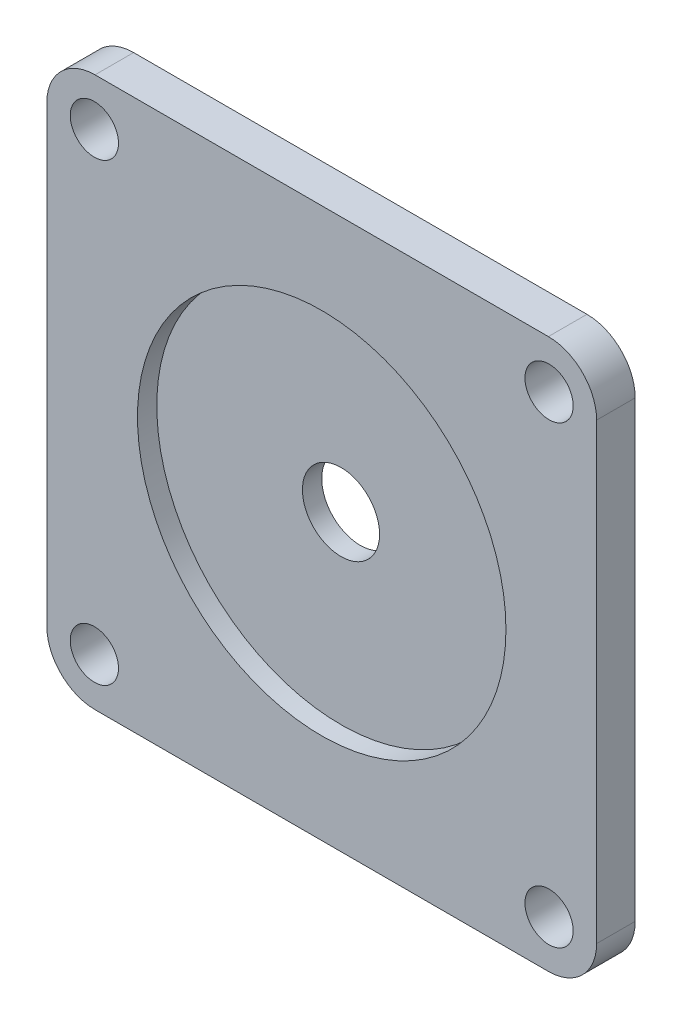
ISO-10303-21;
HEADER;
FILE_DESCRIPTION(('STEP AP214'),'2;1');
FILE_NAME('part.step','',(''),(''),'','','');
FILE_SCHEMA(('AUTOMOTIVE_DESIGN { 1 0 10303 214 1 1 1 1 }'));
ENDSEC;
DATA;
#1=APPLICATION_CONTEXT('core data for automotive mechanical design processes');
#2=APPLICATION_PROTOCOL_DEFINITION('international standard','automotive_design',2000,#1);
#3=PRODUCT_CONTEXT('',#1,'mechanical');
#4=PRODUCT('Part','Part','',(#3));
#5=PRODUCT_RELATED_PRODUCT_CATEGORY('part','',(#4));
#6=PRODUCT_DEFINITION_FORMATION('','',#4);
#7=PRODUCT_DEFINITION_CONTEXT('part definition',#1,'design');
#8=PRODUCT_DEFINITION('design','',#6,#7);
#9=PRODUCT_DEFINITION_SHAPE('','',#8);
#10=(LENGTH_UNIT() NAMED_UNIT(*) SI_UNIT(.MILLI.,.METRE.));
#11=(NAMED_UNIT(*) PLANE_ANGLE_UNIT() SI_UNIT($,.RADIAN.));
#12=(NAMED_UNIT(*) SI_UNIT($,.STERADIAN.) SOLID_ANGLE_UNIT());
#13=UNCERTAINTY_MEASURE_WITH_UNIT(LENGTH_MEASURE(1.E-05),#10,'distance_accuracy_value','');
#14=(GEOMETRIC_REPRESENTATION_CONTEXT(3) GLOBAL_UNCERTAINTY_ASSIGNED_CONTEXT((#13)) GLOBAL_UNIT_ASSIGNED_CONTEXT((#10,
#11,#12)) REPRESENTATION_CONTEXT('',''));
#15=CARTESIAN_POINT('',(0.,0.,0.));
#16=DIRECTION('',(0.,0.,1.));
#17=DIRECTION('',(1.,0.,0.));
#18=AXIS2_PLACEMENT_3D('',#15,#16,#17);
#19=CARTESIAN_POINT('',(0.,0.,4.));
#20=DIRECTION('',(0.,0.,-1.));
#21=DIRECTION('',(-1.,0.,0.));
#22=AXIS2_PLACEMENT_3D('',#19,#20,#21);
#23=PLANE('',#22);
#24=CARTESIAN_POINT('',(0.,0.,4.));
#25=DIRECTION('',(0.,0.,1.));
#26=DIRECTION('',(1.,0.,0.));
#27=AXIS2_PLACEMENT_3D('',#24,#25,#26);
#28=CIRCLE('',#27,19.1);
#29=CARTESIAN_POINT('',(19.1,0.,4.));
#30=VERTEX_POINT('',#29);
#31=EDGE_CURVE('E209',#30,#30,#28,.T.);
#32=ORIENTED_EDGE('',*,*,#31,.F.);
#33=EDGE_LOOP('',(#32));
#34=FACE_BOUND('',#33,.T.);
#35=CARTESIAN_POINT('',(23.57,23.57,4.));
#36=DIRECTION('',(0.,0.,1.));
#37=DIRECTION('',(1.,0.,0.));
#38=AXIS2_PLACEMENT_3D('',#35,#36,#37);
#39=CIRCLE('',#38,2.49999999999999);
#40=CARTESIAN_POINT('',(26.07,23.57,4.));
#41=VERTEX_POINT('',#40);
#42=EDGE_CURVE('E199',#41,#41,#39,.T.);
#43=ORIENTED_EDGE('',*,*,#42,.F.);
#44=EDGE_LOOP('',(#43));
#45=FACE_BOUND('',#44,.T.);
#46=CARTESIAN_POINT('',(23.57,-23.57,4.));
#47=DIRECTION('',(0.,0.,1.));
#48=DIRECTION('',(1.,0.,0.));
#49=AXIS2_PLACEMENT_3D('',#46,#47,#48);
#50=CIRCLE('',#49,2.49999999999999);
#51=CARTESIAN_POINT('',(26.07,-23.57,4.));
#52=VERTEX_POINT('',#51);
#53=EDGE_CURVE('E191',#52,#52,#50,.T.);
#54=ORIENTED_EDGE('',*,*,#53,.F.);
#55=EDGE_LOOP('',(#54));
#56=FACE_BOUND('',#55,.T.);
#57=CARTESIAN_POINT('',(-23.57,-23.57,4.));
#58=DIRECTION('',(0.,0.,1.));
#59=DIRECTION('',(1.,0.,0.));
#60=AXIS2_PLACEMENT_3D('',#57,#58,#59);
#61=CIRCLE('',#60,2.49999999999999);
#62=CARTESIAN_POINT('',(-21.07,-23.57,4.));
#63=VERTEX_POINT('',#62);
#64=EDGE_CURVE('E181',#63,#63,#61,.T.);
#65=ORIENTED_EDGE('',*,*,#64,.F.);
#66=EDGE_LOOP('',(#65));
#67=FACE_BOUND('',#66,.T.);
#68=DIRECTION('',(-1.,0.,0.));
#69=VECTOR('',#68,1.);
#70=CARTESIAN_POINT('',(-28.5,28.5,4.));
#71=LINE('',#70,#69);
#72=CARTESIAN_POINT('',(23.5,28.5,4.));
#73=VERTEX_POINT('',#72);
#74=CARTESIAN_POINT('',(-23.5,28.5,4.));
#75=VERTEX_POINT('',#74);
#76=EDGE_CURVE('E177',#73,#75,#71,.T.);
#77=ORIENTED_EDGE('',*,*,#76,.T.);
#78=CARTESIAN_POINT('',(-23.5,23.5,4.));
#79=DIRECTION('',(0.,0.,-1.));
#80=DIRECTION('',(-1.,0.,0.));
#81=AXIS2_PLACEMENT_3D('',#78,#79,#80);
#82=CIRCLE('',#81,5.);
#83=CARTESIAN_POINT('',(-28.5,23.5,4.));
#84=VERTEX_POINT('',#83);
#85=EDGE_CURVE('E160',#75,#84,#82,.F.);
#86=ORIENTED_EDGE('',*,*,#85,.T.);
#87=DIRECTION('',(0.,-1.,0.));
#88=VECTOR('',#87,1.);
#89=CARTESIAN_POINT('',(-28.5,-28.5,4.));
#90=LINE('',#89,#88);
#91=CARTESIAN_POINT('',(-28.5,-23.5,4.));
#92=VERTEX_POINT('',#91);
#93=EDGE_CURVE('E130',#84,#92,#90,.T.);
#94=ORIENTED_EDGE('',*,*,#93,.T.);
#95=CARTESIAN_POINT('',(-23.5,-23.5,4.));
#96=DIRECTION('',(0.,0.,-1.));
#97=DIRECTION('',(-1.,0.,0.));
#98=AXIS2_PLACEMENT_3D('',#95,#96,#97);
#99=CIRCLE('',#98,5.);
#100=CARTESIAN_POINT('',(-23.5,-28.5,4.));
#101=VERTEX_POINT('',#100);
#102=EDGE_CURVE('E65',#92,#101,#99,.F.);
#103=ORIENTED_EDGE('',*,*,#102,.T.);
#104=DIRECTION('',(1.,0.,0.));
#105=VECTOR('',#104,1.);
#106=CARTESIAN_POINT('',(-28.5,-28.5,4.));
#107=LINE('',#106,#105);
#108=CARTESIAN_POINT('',(23.5,-28.5,4.));
#109=VERTEX_POINT('',#108);
#110=EDGE_CURVE('E141',#101,#109,#107,.T.);
#111=ORIENTED_EDGE('',*,*,#110,.T.);
#112=CARTESIAN_POINT('',(23.5,-23.5,4.));
#113=DIRECTION('',(0.,0.,-1.));
#114=DIRECTION('',(-1.,0.,0.));
#115=AXIS2_PLACEMENT_3D('',#112,#113,#114);
#116=CIRCLE('',#115,5.);
#117=CARTESIAN_POINT('',(28.5,-23.5,4.));
#118=VERTEX_POINT('',#117);
#119=EDGE_CURVE('E152',#109,#118,#116,.F.);
#120=ORIENTED_EDGE('',*,*,#119,.T.);
#121=DIRECTION('',(0.,1.,0.));
#122=VECTOR('',#121,1.);
#123=CARTESIAN_POINT('',(28.5,-28.5,4.));
#124=LINE('',#123,#122);
#125=CARTESIAN_POINT('',(28.5,23.5,4.));
#126=VERTEX_POINT('',#125);
#127=EDGE_CURVE('E140',#118,#126,#124,.T.);
#128=ORIENTED_EDGE('',*,*,#127,.T.);
#129=CARTESIAN_POINT('',(23.5,23.5,4.));
#130=DIRECTION('',(0.,0.,-1.));
#131=DIRECTION('',(-1.,0.,0.));
#132=AXIS2_PLACEMENT_3D('',#129,#130,#131);
#133=CIRCLE('',#132,5.);
#134=EDGE_CURVE('E155',#126,#73,#133,.F.);
#135=ORIENTED_EDGE('',*,*,#134,.T.);
#136=EDGE_LOOP('',(#77,#86,#94,#103,#111,#120,#128,#135));
#137=FACE_BOUND('',#136,.T.);
#138=CARTESIAN_POINT('',(-23.57,23.57,4.));
#139=DIRECTION('',(0.,0.,1.));
#140=DIRECTION('',(1.,0.,0.));
#141=AXIS2_PLACEMENT_3D('',#138,#139,#140);
#142=CIRCLE('',#141,2.49999999999999);
#143=CARTESIAN_POINT('',(-21.07,23.57,4.));
#144=VERTEX_POINT('',#143);
#145=EDGE_CURVE('E206',#144,#144,#142,.T.);
#146=ORIENTED_EDGE('',*,*,#145,.F.);
#147=EDGE_LOOP('',(#146));
#148=FACE_BOUND('',#147,.T.);
#149=ADVANCED_FACE('F41',(#34,#45,#56,#67,#137,#148),#23,.F.);
#150=CARTESIAN_POINT('',(0.,0.,0.));
#151=DIRECTION('',(0.,0.,-1.));
#152=DIRECTION('',(-1.,0.,0.));
#153=AXIS2_PLACEMENT_3D('',#150,#151,#152);
#154=PLANE('',#153);
#155=CARTESIAN_POINT('',(0.,0.,0.));
#156=DIRECTION('',(0.,0.,1.));
#157=DIRECTION('',(1.,0.,0.));
#158=AXIS2_PLACEMENT_3D('',#155,#156,#157);
#159=CIRCLE('',#158,4.);
#160=CARTESIAN_POINT('',(4.,0.,0.));
#161=VERTEX_POINT('',#160);
#162=EDGE_CURVE('E213',#161,#161,#159,.T.);
#163=ORIENTED_EDGE('',*,*,#162,.T.);
#164=EDGE_LOOP('',(#163));
#165=FACE_BOUND('',#164,.T.);
#166=CARTESIAN_POINT('',(-23.57,23.57,0.));
#167=DIRECTION('',(0.,0.,1.));
#168=DIRECTION('',(1.,0.,0.));
#169=AXIS2_PLACEMENT_3D('',#166,#167,#168);
#170=CIRCLE('',#169,2.5);
#171=CARTESIAN_POINT('',(-21.07,23.57,0.));
#172=VERTEX_POINT('',#171);
#173=EDGE_CURVE('E201',#172,#172,#170,.T.);
#174=ORIENTED_EDGE('',*,*,#173,.T.);
#175=EDGE_LOOP('',(#174));
#176=FACE_BOUND('',#175,.T.);
#177=CARTESIAN_POINT('',(23.57,23.57,0.));
#178=DIRECTION('',(0.,0.,1.));
#179=DIRECTION('',(1.,0.,0.));
#180=AXIS2_PLACEMENT_3D('',#177,#178,#179);
#181=CIRCLE('',#180,2.5);
#182=CARTESIAN_POINT('',(26.07,23.57,0.));
#183=VERTEX_POINT('',#182);
#184=EDGE_CURVE('E197',#183,#183,#181,.T.);
#185=ORIENTED_EDGE('',*,*,#184,.T.);
#186=EDGE_LOOP('',(#185));
#187=FACE_BOUND('',#186,.T.);
#188=DIRECTION('',(0.,-1.,0.));
#189=VECTOR('',#188,1.);
#190=CARTESIAN_POINT('',(-28.5,-28.5,0.));
#191=LINE('',#190,#189);
#192=CARTESIAN_POINT('',(-28.5,23.5,0.));
#193=VERTEX_POINT('',#192);
#194=CARTESIAN_POINT('',(-28.5,-23.5,0.));
#195=VERTEX_POINT('',#194);
#196=EDGE_CURVE('E123',#193,#195,#191,.T.);
#197=ORIENTED_EDGE('',*,*,#196,.F.);
#198=CARTESIAN_POINT('',(-23.5,23.5,0.));
#199=DIRECTION('',(0.,0.,-1.));
#200=DIRECTION('',(-1.,0.,0.));
#201=AXIS2_PLACEMENT_3D('',#198,#199,#200);
#202=CIRCLE('',#201,5.);
#203=CARTESIAN_POINT('',(-23.5,28.5,0.));
#204=VERTEX_POINT('',#203);
#205=EDGE_CURVE('E107',#193,#204,#202,.T.);
#206=ORIENTED_EDGE('',*,*,#205,.T.);
#207=DIRECTION('',(-1.,0.,0.));
#208=VECTOR('',#207,1.);
#209=CARTESIAN_POINT('',(-28.5,28.5,0.));
#210=LINE('',#209,#208);
#211=CARTESIAN_POINT('',(23.5,28.5,0.));
#212=VERTEX_POINT('',#211);
#213=EDGE_CURVE('E133',#212,#204,#210,.T.);
#214=ORIENTED_EDGE('',*,*,#213,.F.);
#215=CARTESIAN_POINT('',(23.5,23.5,0.));
#216=DIRECTION('',(0.,0.,-1.));
#217=DIRECTION('',(-1.,0.,0.));
#218=AXIS2_PLACEMENT_3D('',#215,#216,#217);
#219=CIRCLE('',#218,5.);
#220=CARTESIAN_POINT('',(28.5,23.5,0.));
#221=VERTEX_POINT('',#220);
#222=EDGE_CURVE('E126',#212,#221,#219,.T.);
#223=ORIENTED_EDGE('',*,*,#222,.T.);
#224=DIRECTION('',(0.,1.,0.));
#225=VECTOR('',#224,1.);
#226=CARTESIAN_POINT('',(28.5,-28.5,0.));
#227=LINE('',#226,#225);
#228=CARTESIAN_POINT('',(28.5,-23.5,0.));
#229=VERTEX_POINT('',#228);
#230=EDGE_CURVE('E136',#229,#221,#227,.T.);
#231=ORIENTED_EDGE('',*,*,#230,.F.);
#232=CARTESIAN_POINT('',(23.5,-23.5,0.));
#233=DIRECTION('',(0.,0.,-1.));
#234=DIRECTION('',(-1.,0.,0.));
#235=AXIS2_PLACEMENT_3D('',#232,#233,#234);
#236=CIRCLE('',#235,5.);
#237=CARTESIAN_POINT('',(23.5,-28.5,0.));
#238=VERTEX_POINT('',#237);
#239=EDGE_CURVE('E148',#229,#238,#236,.T.);
#240=ORIENTED_EDGE('',*,*,#239,.T.);
#241=DIRECTION('',(1.,0.,0.));
#242=VECTOR('',#241,1.);
#243=CARTESIAN_POINT('',(-28.5,-28.5,0.));
#244=LINE('',#243,#242);
#245=CARTESIAN_POINT('',(-23.5,-28.5,0.));
#246=VERTEX_POINT('',#245);
#247=EDGE_CURVE('E131',#246,#238,#244,.T.);
#248=ORIENTED_EDGE('',*,*,#247,.F.);
#249=CARTESIAN_POINT('',(-23.5,-23.5,0.));
#250=DIRECTION('',(0.,0.,-1.));
#251=DIRECTION('',(-1.,0.,0.));
#252=AXIS2_PLACEMENT_3D('',#249,#250,#251);
#253=CIRCLE('',#252,5.);
#254=EDGE_CURVE('E116',#246,#195,#253,.T.);
#255=ORIENTED_EDGE('',*,*,#254,.T.);
#256=EDGE_LOOP('',(#197,#206,#214,#223,#231,#240,#248,#255));
#257=FACE_BOUND('',#256,.T.);
#258=CARTESIAN_POINT('',(-23.57,-23.57,0.));
#259=DIRECTION('',(0.,0.,1.));
#260=DIRECTION('',(1.,0.,0.));
#261=AXIS2_PLACEMENT_3D('',#258,#259,#260);
#262=CIRCLE('',#261,2.5);
#263=CARTESIAN_POINT('',(-21.07,-23.57,0.));
#264=VERTEX_POINT('',#263);
#265=EDGE_CURVE('E182',#264,#264,#262,.T.);
#266=ORIENTED_EDGE('',*,*,#265,.T.);
#267=EDGE_LOOP('',(#266));
#268=FACE_BOUND('',#267,.T.);
#269=CARTESIAN_POINT('',(23.57,-23.57,0.));
#270=DIRECTION('',(0.,0.,1.));
#271=DIRECTION('',(1.,0.,0.));
#272=AXIS2_PLACEMENT_3D('',#269,#270,#271);
#273=CIRCLE('',#272,2.5);
#274=CARTESIAN_POINT('',(26.07,-23.57,0.));
#275=VERTEX_POINT('',#274);
#276=EDGE_CURVE('E192',#275,#275,#273,.T.);
#277=ORIENTED_EDGE('',*,*,#276,.T.);
#278=EDGE_LOOP('',(#277));
#279=FACE_BOUND('',#278,.T.);
#280=ADVANCED_FACE('F132',(#165,#176,#187,#257,#268,#279),#154,.T.);
#281=CARTESIAN_POINT('',(28.5,-28.5,4.));
#282=DIRECTION('',(-1.,0.,0.));
#283=DIRECTION('',(0.,0.,1.));
#284=AXIS2_PLACEMENT_3D('',#281,#282,#283);
#285=PLANE('',#284);
#286=ORIENTED_EDGE('',*,*,#127,.F.);
#287=DIRECTION('',(0.,0.,-1.));
#288=VECTOR('',#287,1.);
#289=CARTESIAN_POINT('',(28.5,-23.5,4.));
#290=LINE('',#289,#288);
#291=EDGE_CURVE('E11',#118,#229,#290,.T.);
#292=ORIENTED_EDGE('',*,*,#291,.T.);
#293=ORIENTED_EDGE('',*,*,#230,.T.);
#294=DIRECTION('',(0.,0.,-1.));
#295=VECTOR('',#294,1.);
#296=CARTESIAN_POINT('',(28.5,23.5,4.));
#297=LINE('',#296,#295);
#298=EDGE_CURVE('E47',#221,#126,#297,.F.);
#299=ORIENTED_EDGE('',*,*,#298,.T.);
#300=EDGE_LOOP('',(#286,#292,#293,#299));
#301=FACE_BOUND('',#300,.T.);
#302=ADVANCED_FACE('F170',(#301),#285,.F.);
#303=CARTESIAN_POINT('',(-28.5,28.5,4.));
#304=DIRECTION('',(0.,-1.,0.));
#305=DIRECTION('',(0.,0.,-1.));
#306=AXIS2_PLACEMENT_3D('',#303,#304,#305);
#307=PLANE('',#306);
#308=ORIENTED_EDGE('',*,*,#213,.T.);
#309=DIRECTION('',(0.,0.,-1.));
#310=VECTOR('',#309,1.);
#311=CARTESIAN_POINT('',(-23.5,28.5,4.));
#312=LINE('',#311,#310);
#313=EDGE_CURVE('E114',#204,#75,#312,.F.);
#314=ORIENTED_EDGE('',*,*,#313,.T.);
#315=ORIENTED_EDGE('',*,*,#76,.F.);
#316=DIRECTION('',(0.,0.,-1.));
#317=VECTOR('',#316,1.);
#318=CARTESIAN_POINT('',(23.5,28.5,4.));
#319=LINE('',#318,#317);
#320=EDGE_CURVE('E120',#73,#212,#319,.T.);
#321=ORIENTED_EDGE('',*,*,#320,.T.);
#322=EDGE_LOOP('',(#308,#314,#315,#321));
#323=FACE_BOUND('',#322,.T.);
#324=ADVANCED_FACE('F178',(#323),#307,.F.);
#325=CARTESIAN_POINT('',(-28.5,-28.5,4.));
#326=DIRECTION('',(1.,0.,0.));
#327=DIRECTION('',(0.,0.,-1.));
#328=AXIS2_PLACEMENT_3D('',#325,#326,#327);
#329=PLANE('',#328);
#330=ORIENTED_EDGE('',*,*,#93,.F.);
#331=DIRECTION('',(0.,0.,-1.));
#332=VECTOR('',#331,1.);
#333=CARTESIAN_POINT('',(-28.5,23.5,4.));
#334=LINE('',#333,#332);
#335=EDGE_CURVE('E115',#84,#193,#334,.T.);
#336=ORIENTED_EDGE('',*,*,#335,.T.);
#337=ORIENTED_EDGE('',*,*,#196,.T.);
#338=DIRECTION('',(0.,0.,-1.));
#339=VECTOR('',#338,1.);
#340=CARTESIAN_POINT('',(-28.5,-23.5,4.));
#341=LINE('',#340,#339);
#342=EDGE_CURVE('E129',#195,#92,#341,.F.);
#343=ORIENTED_EDGE('',*,*,#342,.T.);
#344=EDGE_LOOP('',(#330,#336,#337,#343));
#345=FACE_BOUND('',#344,.T.);
#346=ADVANCED_FACE('F121',(#345),#329,.F.);
#347=CARTESIAN_POINT('',(-28.5,-28.5,4.));
#348=DIRECTION('',(0.,1.,0.));
#349=DIRECTION('',(0.,0.,1.));
#350=AXIS2_PLACEMENT_3D('',#347,#348,#349);
#351=PLANE('',#350);
#352=ORIENTED_EDGE('',*,*,#110,.F.);
#353=DIRECTION('',(0.,0.,-1.));
#354=VECTOR('',#353,1.);
#355=CARTESIAN_POINT('',(-23.5,-28.5,4.));
#356=LINE('',#355,#354);
#357=EDGE_CURVE('E159',#101,#246,#356,.T.);
#358=ORIENTED_EDGE('',*,*,#357,.T.);
#359=ORIENTED_EDGE('',*,*,#247,.T.);
#360=DIRECTION('',(0.,0.,-1.));
#361=VECTOR('',#360,1.);
#362=CARTESIAN_POINT('',(23.5,-28.5,4.));
#363=LINE('',#362,#361);
#364=EDGE_CURVE('E57',#238,#109,#363,.F.);
#365=ORIENTED_EDGE('',*,*,#364,.T.);
#366=EDGE_LOOP('',(#352,#358,#359,#365));
#367=FACE_BOUND('',#366,.T.);
#368=ADVANCED_FACE('F249',(#367),#351,.F.);
#369=CARTESIAN_POINT('',(-23.57,-23.57,4.));
#370=DIRECTION('',(0.,0.,1.));
#371=DIRECTION('',(1.,0.,0.));
#372=AXIS2_PLACEMENT_3D('',#369,#370,#371);
#373=CYLINDRICAL_SURFACE('',#372,2.49999999999999);
#374=ORIENTED_EDGE('',*,*,#265,.F.);
#375=EDGE_LOOP('',(#374));
#376=FACE_BOUND('',#375,.T.);
#377=ORIENTED_EDGE('',*,*,#64,.T.);
#378=EDGE_LOOP('',(#377));
#379=FACE_BOUND('',#378,.T.);
#380=ADVANCED_FACE('F243',(#376,#379),#373,.F.);
#381=CARTESIAN_POINT('',(23.57,-23.57,4.));
#382=DIRECTION('',(0.,0.,1.));
#383=DIRECTION('',(1.,0.,0.));
#384=AXIS2_PLACEMENT_3D('',#381,#382,#383);
#385=CYLINDRICAL_SURFACE('',#384,2.49999999999999);
#386=ORIENTED_EDGE('',*,*,#276,.F.);
#387=EDGE_LOOP('',(#386));
#388=FACE_BOUND('',#387,.T.);
#389=ORIENTED_EDGE('',*,*,#53,.T.);
#390=EDGE_LOOP('',(#389));
#391=FACE_BOUND('',#390,.T.);
#392=ADVANCED_FACE('F250',(#388,#391),#385,.F.);
#393=CARTESIAN_POINT('',(23.57,23.57,4.));
#394=DIRECTION('',(0.,0.,1.));
#395=DIRECTION('',(1.,0.,0.));
#396=AXIS2_PLACEMENT_3D('',#393,#394,#395);
#397=CYLINDRICAL_SURFACE('',#396,2.49999999999999);
#398=ORIENTED_EDGE('',*,*,#184,.F.);
#399=EDGE_LOOP('',(#398));
#400=FACE_BOUND('',#399,.T.);
#401=ORIENTED_EDGE('',*,*,#42,.T.);
#402=EDGE_LOOP('',(#401));
#403=FACE_BOUND('',#402,.T.);
#404=ADVANCED_FACE('F255',(#400,#403),#397,.F.);
#405=CARTESIAN_POINT('',(-23.57,23.57,4.));
#406=DIRECTION('',(0.,0.,1.));
#407=DIRECTION('',(1.,0.,0.));
#408=AXIS2_PLACEMENT_3D('',#405,#406,#407);
#409=CYLINDRICAL_SURFACE('',#408,2.49999999999999);
#410=ORIENTED_EDGE('',*,*,#173,.F.);
#411=EDGE_LOOP('',(#410));
#412=FACE_BOUND('',#411,.T.);
#413=ORIENTED_EDGE('',*,*,#145,.T.);
#414=EDGE_LOOP('',(#413));
#415=FACE_BOUND('',#414,.T.);
#416=ADVANCED_FACE('F273',(#412,#415),#409,.F.);
#417=CARTESIAN_POINT('',(-23.5,23.5,4.));
#418=DIRECTION('',(0.,0.,-1.));
#419=DIRECTION('',(-1.,0.,0.));
#420=AXIS2_PLACEMENT_3D('',#417,#418,#419);
#421=CYLINDRICAL_SURFACE('',#420,5.);
#422=ORIENTED_EDGE('',*,*,#85,.F.);
#423=ORIENTED_EDGE('',*,*,#313,.F.);
#424=ORIENTED_EDGE('',*,*,#205,.F.);
#425=ORIENTED_EDGE('',*,*,#335,.F.);
#426=EDGE_LOOP('',(#422,#423,#424,#425));
#427=FACE_BOUND('',#426,.T.);
#428=ADVANCED_FACE('F112',(#427),#421,.T.);
#429=CARTESIAN_POINT('',(-23.5,-23.5,4.));
#430=DIRECTION('',(0.,0.,-1.));
#431=DIRECTION('',(-1.,0.,0.));
#432=AXIS2_PLACEMENT_3D('',#429,#430,#431);
#433=CYLINDRICAL_SURFACE('',#432,5.);
#434=ORIENTED_EDGE('',*,*,#102,.F.);
#435=ORIENTED_EDGE('',*,*,#342,.F.);
#436=ORIENTED_EDGE('',*,*,#254,.F.);
#437=ORIENTED_EDGE('',*,*,#357,.F.);
#438=EDGE_LOOP('',(#434,#435,#436,#437));
#439=FACE_BOUND('',#438,.T.);
#440=ADVANCED_FACE('F272',(#439),#433,.T.);
#441=CARTESIAN_POINT('',(23.5,-23.5,4.));
#442=DIRECTION('',(0.,0.,-1.));
#443=DIRECTION('',(-1.,0.,0.));
#444=AXIS2_PLACEMENT_3D('',#441,#442,#443);
#445=CYLINDRICAL_SURFACE('',#444,5.);
#446=ORIENTED_EDGE('',*,*,#119,.F.);
#447=ORIENTED_EDGE('',*,*,#364,.F.);
#448=ORIENTED_EDGE('',*,*,#239,.F.);
#449=ORIENTED_EDGE('',*,*,#291,.F.);
#450=EDGE_LOOP('',(#446,#447,#448,#449));
#451=FACE_BOUND('',#450,.T.);
#452=ADVANCED_FACE('F277',(#451),#445,.T.);
#453=CARTESIAN_POINT('',(23.5,23.5,4.));
#454=DIRECTION('',(0.,0.,-1.));
#455=DIRECTION('',(-1.,0.,0.));
#456=AXIS2_PLACEMENT_3D('',#453,#454,#455);
#457=CYLINDRICAL_SURFACE('',#456,5.);
#458=ORIENTED_EDGE('',*,*,#134,.F.);
#459=ORIENTED_EDGE('',*,*,#298,.F.);
#460=ORIENTED_EDGE('',*,*,#222,.F.);
#461=ORIENTED_EDGE('',*,*,#320,.F.);
#462=EDGE_LOOP('',(#458,#459,#460,#461));
#463=FACE_BOUND('',#462,.T.);
#464=ADVANCED_FACE('F43',(#463),#457,.T.);
#465=CARTESIAN_POINT('',(0.,0.,2.));
#466=DIRECTION('',(0.,0.,1.));
#467=DIRECTION('',(1.,0.,0.));
#468=AXIS2_PLACEMENT_3D('',#465,#466,#467);
#469=CYLINDRICAL_SURFACE('',#468,19.1);
#470=CARTESIAN_POINT('',(0.,0.,2.));
#471=DIRECTION('',(0.,0.,1.));
#472=DIRECTION('',(1.,0.,0.));
#473=AXIS2_PLACEMENT_3D('',#470,#471,#472);
#474=CIRCLE('',#473,19.1);
#475=CARTESIAN_POINT('',(19.1,0.,2.));
#476=VERTEX_POINT('',#475);
#477=EDGE_CURVE('E207',#476,#476,#474,.T.);
#478=ORIENTED_EDGE('',*,*,#477,.F.);
#479=EDGE_LOOP('',(#478));
#480=FACE_BOUND('',#479,.T.);
#481=ORIENTED_EDGE('',*,*,#31,.T.);
#482=EDGE_LOOP('',(#481));
#483=FACE_BOUND('',#482,.T.);
#484=ADVANCED_FACE('F229',(#480,#483),#469,.F.);
#485=CARTESIAN_POINT('',(0.,0.,2.));
#486=DIRECTION('',(0.,0.,1.));
#487=DIRECTION('',(1.,0.,0.));
#488=AXIS2_PLACEMENT_3D('',#485,#486,#487);
#489=PLANE('',#488);
#490=CARTESIAN_POINT('',(0.,0.,2.));
#491=DIRECTION('',(0.,0.,1.));
#492=DIRECTION('',(1.,0.,0.));
#493=AXIS2_PLACEMENT_3D('',#490,#491,#492);
#494=CIRCLE('',#493,4.);
#495=CARTESIAN_POINT('',(4.,0.,2.));
#496=VERTEX_POINT('',#495);
#497=EDGE_CURVE('E217',#496,#496,#494,.T.);
#498=ORIENTED_EDGE('',*,*,#497,.F.);
#499=EDGE_LOOP('',(#498));
#500=FACE_BOUND('',#499,.T.);
#501=ORIENTED_EDGE('',*,*,#477,.T.);
#502=EDGE_LOOP('',(#501));
#503=FACE_BOUND('',#502,.T.);
#504=ADVANCED_FACE('F221',(#500,#503),#489,.T.);
#505=CARTESIAN_POINT('',(0.,0.,2.));
#506=DIRECTION('',(0.,0.,1.));
#507=DIRECTION('',(1.,0.,0.));
#508=AXIS2_PLACEMENT_3D('',#505,#506,#507);
#509=CYLINDRICAL_SURFACE('',#508,4.);
#510=ORIENTED_EDGE('',*,*,#162,.F.);
#511=EDGE_LOOP('',(#510));
#512=FACE_BOUND('',#511,.T.);
#513=ORIENTED_EDGE('',*,*,#497,.T.);
#514=EDGE_LOOP('',(#513));
#515=FACE_BOUND('',#514,.T.);
#516=ADVANCED_FACE('F225',(#512,#515),#509,.F.);
#517=CLOSED_SHELL('',(#149,#280,#302,#324,#346,#368,#380,#392,#404,#416,#428,#440,#452,#464,
#484,#504,#516));
#518=MANIFOLD_SOLID_BREP('B2',#517);
#519=ADVANCED_BREP_SHAPE_REPRESENTATION('',(#18,#518),#14);
#520=SHAPE_DEFINITION_REPRESENTATION(#9,#519);
ENDSEC;
END-ISO-10303-21;
